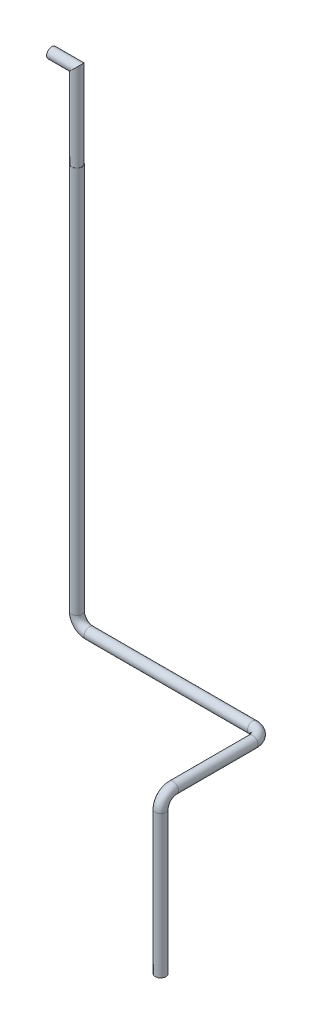
ISO-10303-21;
HEADER;
FILE_DESCRIPTION(('STEP AP214'),'2;1');
FILE_NAME('part.step','',(''),(''),'','','');
FILE_SCHEMA(('AUTOMOTIVE_DESIGN { 1 0 10303 214 1 1 1 1 }'));
ENDSEC;
DATA;
#1=APPLICATION_CONTEXT('core data for automotive mechanical design processes');
#2=APPLICATION_PROTOCOL_DEFINITION('international standard','automotive_design',2000,#1);
#3=PRODUCT_CONTEXT('',#1,'mechanical');
#4=PRODUCT('Part','Part','',(#3));
#5=PRODUCT_RELATED_PRODUCT_CATEGORY('part','',(#4));
#6=PRODUCT_DEFINITION_FORMATION('','',#4);
#7=PRODUCT_DEFINITION_CONTEXT('part definition',#1,'design');
#8=PRODUCT_DEFINITION('design','',#6,#7);
#9=PRODUCT_DEFINITION_SHAPE('','',#8);
#10=(LENGTH_UNIT() NAMED_UNIT(*) SI_UNIT(.MILLI.,.METRE.));
#11=(NAMED_UNIT(*) PLANE_ANGLE_UNIT() SI_UNIT($,.RADIAN.));
#12=(NAMED_UNIT(*) SI_UNIT($,.STERADIAN.) SOLID_ANGLE_UNIT());
#13=UNCERTAINTY_MEASURE_WITH_UNIT(LENGTH_MEASURE(1.E-05),#10,'distance_accuracy_value','');
#14=(GEOMETRIC_REPRESENTATION_CONTEXT(3) GLOBAL_UNCERTAINTY_ASSIGNED_CONTEXT((#13)) GLOBAL_UNIT_ASSIGNED_CONTEXT((#10,
#11,#12)) REPRESENTATION_CONTEXT('',''));
#15=CARTESIAN_POINT('',(0.,0.,0.));
#16=DIRECTION('',(0.,0.,1.));
#17=DIRECTION('',(1.,0.,0.));
#18=AXIS2_PLACEMENT_3D('',#15,#16,#17);
#19=CARTESIAN_POINT('',(0.,20.,0.));
#20=DIRECTION('',(0.,-1.,0.));
#21=DIRECTION('',(0.,0.,-1.));
#22=AXIS2_PLACEMENT_3D('',#19,#20,#21);
#23=CYLINDRICAL_SURFACE('',#22,12.7);
#24=CARTESIAN_POINT('',(0.,0.,0.));
#25=DIRECTION('',(0.,1.,0.));
#26=DIRECTION('',(0.,0.,1.));
#27=AXIS2_PLACEMENT_3D('',#24,#25,#26);
#28=CIRCLE('',#27,12.7);
#29=CARTESIAN_POINT('',(0.,0.,12.7));
#30=VERTEX_POINT('',#29);
#31=EDGE_CURVE('E11',#30,#30,#28,.T.);
#32=ORIENTED_EDGE('',*,*,#31,.T.);
#33=EDGE_LOOP('',(#32));
#34=FACE_BOUND('',#33,.T.);
#35=CARTESIAN_POINT('',(0.,340.,0.));
#36=DIRECTION('',(0.,1.,0.));
#37=DIRECTION('',(0.,0.,1.));
#38=AXIS2_PLACEMENT_3D('',#35,#36,#37);
#39=CIRCLE('',#38,12.7);
#40=CARTESIAN_POINT('',(0.,340.,12.7));
#41=VERTEX_POINT('',#40);
#42=EDGE_CURVE('E62',#41,#41,#39,.T.);
#43=ORIENTED_EDGE('',*,*,#42,.F.);
#44=EDGE_LOOP('',(#43));
#45=FACE_BOUND('',#44,.T.);
#46=ADVANCED_FACE('F34',(#34,#45),#23,.T.);
#47=CARTESIAN_POINT('',(0.,0.,0.));
#48=DIRECTION('',(0.,1.,0.));
#49=DIRECTION('',(0.,0.,1.));
#50=AXIS2_PLACEMENT_3D('',#47,#48,#49);
#51=PLANE('',#50);
#52=ORIENTED_EDGE('',*,*,#31,.F.);
#53=EDGE_LOOP('',(#52));
#54=FACE_BOUND('',#53,.T.);
#55=ADVANCED_FACE('F118',(#54),#51,.F.);
#56=CARTESIAN_POINT('',(-450.,1325.,-250.));
#57=DIRECTION('',(0.,1.,0.));
#58=DIRECTION('',(1.,0.,0.));
#59=AXIS2_PLACEMENT_3D('',#56,#57,#58);
#60=PLANE('',#59);
#61=CARTESIAN_POINT('',(-450.,1325.,-250.));
#62=DIRECTION('',(0.,1.,0.));
#63=DIRECTION('',(0.,0.,1.));
#64=AXIS2_PLACEMENT_3D('',#61,#62,#63);
#65=CIRCLE('',#64,12.25);
#66=CARTESIAN_POINT('',(-450.,1325.,-237.75));
#67=VERTEX_POINT('',#66);
#68=EDGE_CURVE('E59',#67,#67,#65,.T.);
#69=ORIENTED_EDGE('',*,*,#68,.F.);
#70=EDGE_LOOP('',(#69));
#71=FACE_BOUND('',#70,.T.);
#72=CARTESIAN_POINT('',(-450.,1325.,-250.));
#73=DIRECTION('',(0.,1.,0.));
#74=DIRECTION('',(1.,0.,0.));
#75=AXIS2_PLACEMENT_3D('',#72,#73,#74);
#76=CIRCLE('',#75,12.7);
#77=CARTESIAN_POINT('',(-437.3,1325.,-250.));
#78=VERTEX_POINT('',#77);
#79=EDGE_CURVE('E41',#78,#78,#76,.T.);
#80=ORIENTED_EDGE('',*,*,#79,.T.);
#81=EDGE_LOOP('',(#80));
#82=FACE_BOUND('',#81,.T.);
#83=ADVANCED_FACE('F113',(#71,#82),#60,.T.);
#84=CARTESIAN_POINT('',(0.,340.,-30.));
#85=DIRECTION('',(-1.,0.,0.));
#86=DIRECTION('',(0.,0.,1.));
#87=AXIS2_PLACEMENT_3D('',#84,#85,#86);
#88=TOROIDAL_SURFACE('',#87,30.,12.7);
#89=CARTESIAN_POINT('',(0.,370.,-30.));
#90=DIRECTION('',(0.,0.,-1.));
#91=DIRECTION('',(0.,1.,0.));
#92=AXIS2_PLACEMENT_3D('',#89,#90,#91);
#93=CIRCLE('',#92,12.7);
#94=CARTESIAN_POINT('',(0.,382.7,-30.));
#95=VERTEX_POINT('',#94);
#96=EDGE_CURVE('E68',#95,#95,#93,.T.);
#97=CARTESIAN_POINT('',(0.,340.,-30.));
#98=DIRECTION('',(-1.,0.,0.));
#99=DIRECTION('',(0.,0.,1.));
#100=AXIS2_PLACEMENT_3D('',#97,#98,#99);
#101=CIRCLE('',#100,42.7);
#102=EDGE_CURVE('',#41,#95,#101,.T.);
#103=ORIENTED_EDGE('',*,*,#42,.T.);
#104=ORIENTED_EDGE('',*,*,#96,.F.);
#105=ORIENTED_EDGE('',*,*,#102,.T.);
#106=ORIENTED_EDGE('',*,*,#102,.F.);
#107=EDGE_LOOP('',(#103,#105,#104,#106));
#108=FACE_BOUND('',#107,.T.);
#109=ADVANCED_FACE('F107',(#108),#88,.T.);
#110=CARTESIAN_POINT('',(0.,370.,-30.));
#111=DIRECTION('',(0.,0.,-1.));
#112=DIRECTION('',(-1.,0.,0.));
#113=AXIS2_PLACEMENT_3D('',#110,#111,#112);
#114=CYLINDRICAL_SURFACE('',#113,12.7);
#115=CARTESIAN_POINT('',(0.,370.,-220.));
#116=DIRECTION('',(0.,0.,-1.));
#117=DIRECTION('',(0.,1.,0.));
#118=AXIS2_PLACEMENT_3D('',#115,#116,#117);
#119=CIRCLE('',#118,12.7);
#120=CARTESIAN_POINT('',(12.7,370.,-220.));
#121=VERTEX_POINT('',#120);
#122=EDGE_CURVE('E71',#121,#121,#119,.T.);
#123=ORIENTED_EDGE('',*,*,#122,.F.);
#124=EDGE_LOOP('',(#123));
#125=FACE_BOUND('',#124,.T.);
#126=ORIENTED_EDGE('',*,*,#96,.T.);
#127=EDGE_LOOP('',(#126));
#128=FACE_BOUND('',#127,.T.);
#129=ADVANCED_FACE('F101',(#125,#128),#114,.T.);
#130=CARTESIAN_POINT('',(-30.,370.,-220.));
#131=DIRECTION('',(0.,1.,0.));
#132=DIRECTION('',(0.,0.,1.));
#133=AXIS2_PLACEMENT_3D('',#130,#131,#132);
#134=TOROIDAL_SURFACE('',#133,30.,12.7);
#135=CARTESIAN_POINT('',(-30.,370.,-250.));
#136=DIRECTION('',(-1.,0.,0.));
#137=DIRECTION('',(0.,1.,0.));
#138=AXIS2_PLACEMENT_3D('',#135,#136,#137);
#139=CIRCLE('',#138,12.7);
#140=CARTESIAN_POINT('',(-30.,370.,-262.7));
#141=VERTEX_POINT('',#140);
#142=EDGE_CURVE('E74',#141,#141,#139,.T.);
#143=CARTESIAN_POINT('',(-30.,370.,-220.));
#144=DIRECTION('',(0.,1.,0.));
#145=DIRECTION('',(0.,0.,1.));
#146=AXIS2_PLACEMENT_3D('',#143,#144,#145);
#147=CIRCLE('',#146,42.7);
#148=EDGE_CURVE('',#121,#141,#147,.T.);
#149=ORIENTED_EDGE('',*,*,#122,.T.);
#150=ORIENTED_EDGE('',*,*,#142,.F.);
#151=ORIENTED_EDGE('',*,*,#148,.T.);
#152=ORIENTED_EDGE('',*,*,#148,.F.);
#153=EDGE_LOOP('',(#149,#151,#150,#152));
#154=FACE_BOUND('',#153,.T.);
#155=ADVANCED_FACE('F95',(#154),#134,.T.);
#156=CARTESIAN_POINT('',(-30.,370.,-250.));
#157=DIRECTION('',(-1.,0.,0.));
#158=DIRECTION('',(0.,0.,1.));
#159=AXIS2_PLACEMENT_3D('',#156,#157,#158);
#160=CYLINDRICAL_SURFACE('',#159,12.7);
#161=CARTESIAN_POINT('',(-420.,370.,-250.));
#162=DIRECTION('',(-1.,0.,0.));
#163=DIRECTION('',(0.,1.,0.));
#164=AXIS2_PLACEMENT_3D('',#161,#162,#163);
#165=CIRCLE('',#164,12.7);
#166=CARTESIAN_POINT('',(-420.,357.3,-250.));
#167=VERTEX_POINT('',#166);
#168=EDGE_CURVE('E77',#167,#167,#165,.T.);
#169=ORIENTED_EDGE('',*,*,#168,.F.);
#170=EDGE_LOOP('',(#169));
#171=FACE_BOUND('',#170,.T.);
#172=ORIENTED_EDGE('',*,*,#142,.T.);
#173=EDGE_LOOP('',(#172));
#174=FACE_BOUND('',#173,.T.);
#175=ADVANCED_FACE('F89',(#171,#174),#160,.T.);
#176=CARTESIAN_POINT('',(-420.,400.,-250.));
#177=DIRECTION('',(0.,0.,-1.));
#178=DIRECTION('',(-1.,0.,0.));
#179=AXIS2_PLACEMENT_3D('',#176,#177,#178);
#180=TOROIDAL_SURFACE('',#179,30.,12.7);
#181=CARTESIAN_POINT('',(-450.,400.,-250.));
#182=DIRECTION('',(0.,1.,0.));
#183=DIRECTION('',(1.,0.,0.));
#184=AXIS2_PLACEMENT_3D('',#181,#182,#183);
#185=CIRCLE('',#184,12.7);
#186=CARTESIAN_POINT('',(-462.7,400.,-250.));
#187=VERTEX_POINT('',#186);
#188=EDGE_CURVE('E80',#187,#187,#185,.T.);
#189=CARTESIAN_POINT('',(-420.,400.,-250.));
#190=DIRECTION('',(0.,0.,-1.));
#191=DIRECTION('',(-1.,0.,0.));
#192=AXIS2_PLACEMENT_3D('',#189,#190,#191);
#193=CIRCLE('',#192,42.7);
#194=EDGE_CURVE('',#167,#187,#193,.T.);
#195=ORIENTED_EDGE('',*,*,#168,.T.);
#196=ORIENTED_EDGE('',*,*,#188,.F.);
#197=ORIENTED_EDGE('',*,*,#194,.T.);
#198=ORIENTED_EDGE('',*,*,#194,.F.);
#199=EDGE_LOOP('',(#195,#197,#196,#198));
#200=FACE_BOUND('',#199,.T.);
#201=ADVANCED_FACE('F86',(#200),#180,.T.);
#202=CARTESIAN_POINT('',(-450.,400.,-250.));
#203=DIRECTION('',(0.,1.,0.));
#204=DIRECTION('',(0.,0.,1.));
#205=AXIS2_PLACEMENT_3D('',#202,#203,#204);
#206=CYLINDRICAL_SURFACE('',#205,12.7);
#207=ORIENTED_EDGE('',*,*,#79,.F.);
#208=EDGE_LOOP('',(#207));
#209=FACE_BOUND('',#208,.T.);
#210=ORIENTED_EDGE('',*,*,#188,.T.);
#211=EDGE_LOOP('',(#210));
#212=FACE_BOUND('',#211,.T.);
#213=ADVANCED_FACE('F84',(#209,#212),#206,.T.);
#214=CARTESIAN_POINT('',(-450.,1475.,-250.));
#215=DIRECTION('',(0.,-1.,0.));
#216=DIRECTION('',(0.,0.,-1.));
#217=AXIS2_PLACEMENT_3D('',#214,#215,#216);
#218=CYLINDRICAL_SURFACE('',#217,12.25);
#219=ORIENTED_EDGE('',*,*,#68,.T.);
#220=EDGE_LOOP('',(#219));
#221=FACE_BOUND('',#220,.T.);
#222=CARTESIAN_POINT('',(-450.,1525.,-250.));
#223=DIRECTION('',(-0.707106781186548,0.707106781186548,0.));
#224=DIRECTION('',(0.707106781186548,0.707106781186548,0.));
#225=AXIS2_PLACEMENT_3D('',#222,#223,#224);
#226=ELLIPSE('',#225,17.3241161390704,12.25);
#227=CARTESIAN_POINT('',(-437.75,1537.25,-250.));
#228=VERTEX_POINT('',#227);
#229=EDGE_CURVE('E55',#228,#228,#226,.F.);
#230=ORIENTED_EDGE('',*,*,#229,.T.);
#231=EDGE_LOOP('',(#230));
#232=FACE_BOUND('',#231,.T.);
#233=ADVANCED_FACE('F130',(#221,#232),#218,.T.);
#234=CARTESIAN_POINT('',(-510.,1525.,-250.));
#235=DIRECTION('',(-1.,0.,0.));
#236=DIRECTION('',(0.,0.,1.));
#237=AXIS2_PLACEMENT_3D('',#234,#235,#236);
#238=PLANE('',#237);
#239=CARTESIAN_POINT('',(-510.,1525.,-250.));
#240=DIRECTION('',(-1.,0.,0.));
#241=DIRECTION('',(0.,0.,1.));
#242=AXIS2_PLACEMENT_3D('',#239,#240,#241);
#243=CIRCLE('',#242,12.25);
#244=CARTESIAN_POINT('',(-510.,1525.,-237.75));
#245=VERTEX_POINT('',#244);
#246=EDGE_CURVE('E50',#245,#245,#243,.T.);
#247=ORIENTED_EDGE('',*,*,#246,.T.);
#248=EDGE_LOOP('',(#247));
#249=FACE_BOUND('',#248,.T.);
#250=ADVANCED_FACE('F137',(#249),#238,.T.);
#251=CARTESIAN_POINT('',(-422.95,1525.,-250.));
#252=DIRECTION('',(-1.,0.,0.));
#253=DIRECTION('',(0.,0.,1.));
#254=AXIS2_PLACEMENT_3D('',#251,#252,#253);
#255=CYLINDRICAL_SURFACE('',#254,12.25);
#256=ORIENTED_EDGE('',*,*,#229,.F.);
#257=EDGE_LOOP('',(#256));
#258=FACE_BOUND('',#257,.T.);
#259=ORIENTED_EDGE('',*,*,#246,.F.);
#260=EDGE_LOOP('',(#259));
#261=FACE_BOUND('',#260,.T.);
#262=ADVANCED_FACE('F56',(#258,#261),#255,.T.);
#263=CLOSED_SHELL('',(#46,#55,#83,#109,#129,#155,#175,#201,#213,#233,#250,#262));
#264=MANIFOLD_SOLID_BREP('B2',#263);
#265=ADVANCED_BREP_SHAPE_REPRESENTATION('',(#18,#264),#14);
#266=SHAPE_DEFINITION_REPRESENTATION(#9,#265);
ENDSEC;
END-ISO-10303-21;
